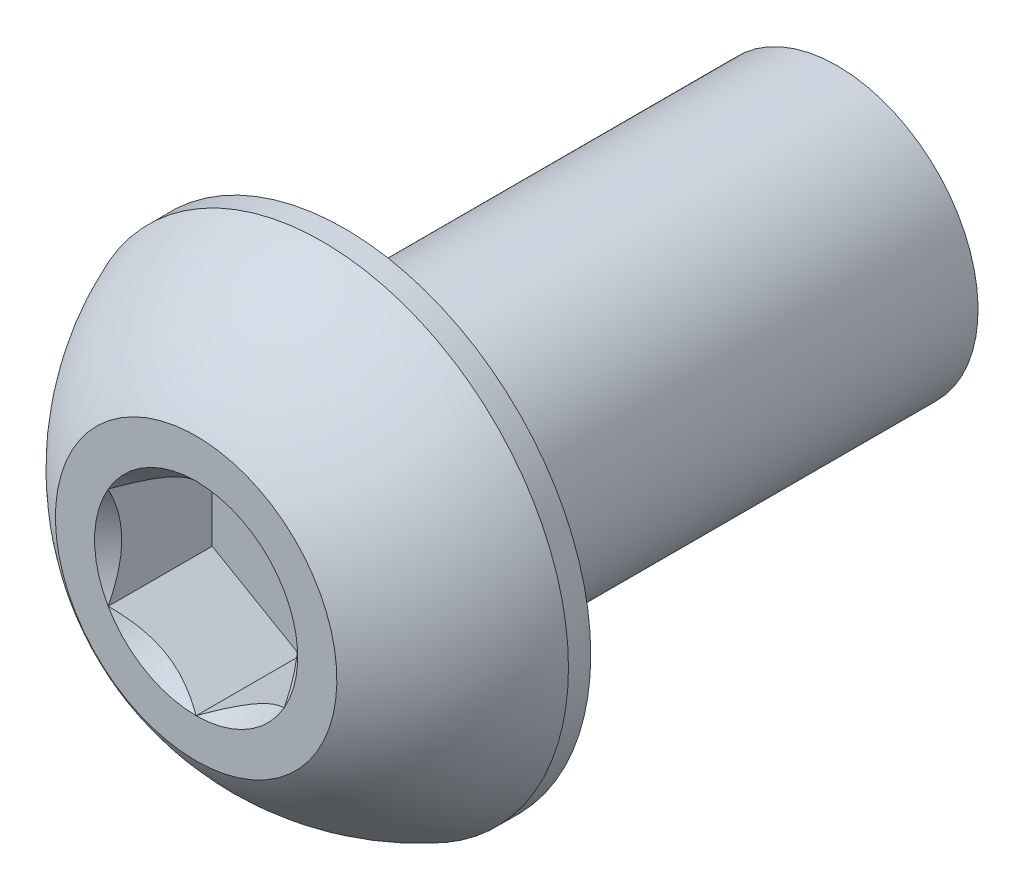
ISO-10303-21;
HEADER;
FILE_DESCRIPTION(('STEP AP214'),'2;1');
FILE_NAME('part.step','',(''),(''),'','','');
FILE_SCHEMA(('AUTOMOTIVE_DESIGN { 1 0 10303 214 1 1 1 1 }'));
ENDSEC;
DATA;
#1=APPLICATION_CONTEXT('core data for automotive mechanical design processes');
#2=APPLICATION_PROTOCOL_DEFINITION('international standard','automotive_design',2000,#1);
#3=PRODUCT_CONTEXT('',#1,'mechanical');
#4=PRODUCT('Part','Part','',(#3));
#5=PRODUCT_RELATED_PRODUCT_CATEGORY('part','',(#4));
#6=PRODUCT_DEFINITION_FORMATION('','',#4);
#7=PRODUCT_DEFINITION_CONTEXT('part definition',#1,'design');
#8=PRODUCT_DEFINITION('design','',#6,#7);
#9=PRODUCT_DEFINITION_SHAPE('','',#8);
#10=(LENGTH_UNIT() NAMED_UNIT(*) SI_UNIT(.MILLI.,.METRE.));
#11=(NAMED_UNIT(*) PLANE_ANGLE_UNIT() SI_UNIT($,.RADIAN.));
#12=(NAMED_UNIT(*) SI_UNIT($,.STERADIAN.) SOLID_ANGLE_UNIT());
#13=UNCERTAINTY_MEASURE_WITH_UNIT(LENGTH_MEASURE(1.E-05),#10,'distance_accuracy_value','');
#14=(GEOMETRIC_REPRESENTATION_CONTEXT(3) GLOBAL_UNCERTAINTY_ASSIGNED_CONTEXT((#13)) GLOBAL_UNIT_ASSIGNED_CONTEXT((#10,
#11,#12)) REPRESENTATION_CONTEXT('',''));
#15=CARTESIAN_POINT('',(0.,0.,0.));
#16=DIRECTION('',(0.,0.,1.));
#17=DIRECTION('',(1.,0.,0.));
#18=AXIS2_PLACEMENT_3D('',#15,#16,#17);
#19=CARTESIAN_POINT('',(0.,-3.17500000000001,-14.4653));
#20=DIRECTION('',(0.,0.,-1.));
#21=DIRECTION('',(0.,1.,0.));
#22=AXIS2_PLACEMENT_3D('',#19,#20,#21);
#23=PLANE('',#22);
#24=CARTESIAN_POINT('',(0.,0.,-14.4653));
#25=DIRECTION('',(0.,0.,-1.));
#26=DIRECTION('',(0.,1.,0.));
#27=AXIS2_PLACEMENT_3D('',#24,#25,#26);
#28=CIRCLE('',#27,3.17500000000001);
#29=CARTESIAN_POINT('',(0.,3.175,-14.4653));
#30=VERTEX_POINT('',#29);
#31=EDGE_CURVE('E49',#30,#30,#28,.T.);
#32=ORIENTED_EDGE('',*,*,#31,.T.);
#33=EDGE_LOOP('',(#32));
#34=FACE_BOUND('',#33,.T.);
#35=ADVANCED_FACE('F36',(#34),#23,.T.);
#36=CARTESIAN_POINT('',(0.,0.,-14.4653));
#37=DIRECTION('',(0.,0.,-1.));
#38=DIRECTION('',(0.,1.,0.));
#39=AXIS2_PLACEMENT_3D('',#36,#37,#38);
#40=CYLINDRICAL_SURFACE('',#39,3.17500000000001);
#41=CARTESIAN_POINT('',(0.,0.,-3.3528));
#42=DIRECTION('',(0.,0.,1.));
#43=DIRECTION('',(1.,0.,0.));
#44=AXIS2_PLACEMENT_3D('',#41,#42,#43);
#45=CIRCLE('',#44,3.17500000000001);
#46=CARTESIAN_POINT('',(3.17500000000001,0.,-3.3528));
#47=VERTEX_POINT('',#46);
#48=EDGE_CURVE('E172',#47,#47,#45,.F.);
#49=ORIENTED_EDGE('',*,*,#48,.T.);
#50=EDGE_LOOP('',(#49));
#51=FACE_BOUND('',#50,.T.);
#52=ORIENTED_EDGE('',*,*,#31,.F.);
#53=EDGE_LOOP('',(#52));
#54=FACE_BOUND('',#53,.T.);
#55=ADVANCED_FACE('F178',(#51,#54),#40,.T.);
#56=CARTESIAN_POINT('',(0.,0.,-5.060315));
#57=DIRECTION('',(0.,0.,1.));
#58=DIRECTION('',(0.,-1.,0.));
#59=AXIS2_PLACEMENT_3D('',#56,#57,#58);
#60=SPHERICAL_SURFACE('',#59,5.97389428256184);
#61=CARTESIAN_POINT('',(0.,0.,0.));
#62=DIRECTION('',(0.,0.,1.));
#63=DIRECTION('',(1.,0.,0.));
#64=AXIS2_PLACEMENT_3D('',#61,#62,#63);
#65=CIRCLE('',#64,3.175);
#66=CARTESIAN_POINT('',(0.,-3.175,0.));
#67=VERTEX_POINT('',#66);
#68=EDGE_CURVE('E169',#67,#67,#65,.T.);
#69=CARTESIAN_POINT('',(0.,0.,-2.84988));
#70=DIRECTION('',(0.,0.,1.));
#71=DIRECTION('',(1.,0.,0.));
#72=AXIS2_PLACEMENT_3D('',#69,#70,#71);
#73=CIRCLE('',#72,5.5499);
#74=CARTESIAN_POINT('',(0.,-5.5499,-2.84988));
#75=VERTEX_POINT('',#74);
#76=EDGE_CURVE('E163',#75,#75,#73,.T.);
#77=CARTESIAN_POINT('',(0.,-3.175,0.));
#78=CARTESIAN_POINT('',(0.,-3.20828343957184,-0.0208830076580488));
#79=CARTESIAN_POINT('',(0.,-3.24136078860705,-0.0420944789280492));
#80=CARTESIAN_POINT('',(0.,-3.3070905577514,-0.0851658910984713));
#81=CARTESIAN_POINT('',(0.,-3.33974297786056,-0.107025831998893));
#82=CARTESIAN_POINT('',(0.,-3.40461014130008,-0.151385725836676));
#83=CARTESIAN_POINT('',(0.,-3.43682488463043,-0.173885678774038));
#84=CARTESIAN_POINT('',(0.,-3.50080416139461,-0.219516822259478));
#85=CARTESIAN_POINT('',(0.,-3.53256869482844,-0.242648012807557));
#86=CARTESIAN_POINT('',(0.,-3.59563518208834,-0.289532629449102));
#87=CARTESIAN_POINT('',(0.,-3.62693713591442,-0.313286055542568));
#88=CARTESIAN_POINT('',(0.,-3.68906627753106,-0.361405894091329));
#89=CARTESIAN_POINT('',(0.,-3.71989346532163,-0.385772306546625));
#90=CARTESIAN_POINT('',(0.,-3.78106107243204,-0.435108631276876));
#91=CARTESIAN_POINT('',(0.,-3.81140149175189,-0.460078543551832));
#92=CARTESIAN_POINT('',(0.,-3.87158374923259,-0.510612146063937));
#93=CARTESIAN_POINT('',(0.,-3.90142558739343,-0.536175836301086));
#94=CARTESIAN_POINT('',(0.,-3.96059906392414,-0.587887041792083));
#95=CARTESIAN_POINT('',(0.,-3.989930702294,-0.614034557045931));
#96=CARTESIAN_POINT('',(0.,-4.04807235926832,-0.666903232293406));
#97=CARTESIAN_POINT('',(0.,-4.07688237787279,-0.693624392287033));
#98=CARTESIAN_POINT('',(0.,-4.13396957842491,-0.747629953401057));
#99=CARTESIAN_POINT('',(0.,-4.16224676037256,-0.774914354521453));
#100=CARTESIAN_POINT('',(0.,-4.21825727817542,-0.830035774981947));
#101=CARTESIAN_POINT('',(0.,-4.24599061403061,-0.857872794322044));
#102=CARTESIAN_POINT('',(0.,-4.30090264195357,-0.91408861315902));
#103=CARTESIAN_POINT('',(0.,-4.32808133402134,-0.942467412655899));
#104=CARTESIAN_POINT('',(0.,-4.38187349261952,-0.999755742806741));
#105=CARTESIAN_POINT('',(0.,-4.40848695914995,-1.0286652734607));
#106=CARTESIAN_POINT('',(0.,-4.46113830498838,-1.08700381029123));
#107=CARTESIAN_POINT('',(0.,-4.48717618429639,-1.11643281646778));
#108=CARTESIAN_POINT('',(0.,-4.53866621810402,-1.17579884645643));
#109=CARTESIAN_POINT('',(0.,-4.56411837260364,-1.20573587026853));
#110=CARTESIAN_POINT('',(0.,-4.61442704725457,-1.26610627984964));
#111=CARTESIAN_POINT('',(0.,-4.63928356740587,-1.29653966561866));
#112=CARTESIAN_POINT('',(0.,-4.68839129572448,-1.3578909501815));
#113=CARTESIAN_POINT('',(0.,-4.71264250389178,-1.38880884897531));
#114=CARTESIAN_POINT('',(0.,-4.76053016627881,-1.45111712201534));
#115=CARTESIAN_POINT('',(0.,-4.78416662049853,-1.48250749626155));
#116=CARTESIAN_POINT('',(0.,-4.8308155723751,-1.54574849868041));
#117=CARTESIAN_POINT('',(0.,-4.85382807003194,-1.57759912685306));
#118=CARTESIAN_POINT('',(0.,-4.89922014909859,-1.64174823640362));
#119=CARTESIAN_POINT('',(0.,-4.92159973050841,-1.67404671778154));
#120=CARTESIAN_POINT('',(0.,-4.96571726381658,-1.73907895865427));
#121=CARTESIAN_POINT('',(0.,-4.98745521571493,-1.77181271814908));
#122=CARTESIAN_POINT('',(0.,-5.03028102654719,-1.83770277069632));
#123=CARTESIAN_POINT('',(0.,-5.0513688854811,-1.87085906374874));
#124=CARTESIAN_POINT('',(0.,-5.09288630004063,-1.93758127434189));
#125=CARTESIAN_POINT('',(0.,-5.11331585566624,-1.97114719188261));
#126=CARTESIAN_POINT('',(0.,-5.15350870956168,-2.03867558290299));
#127=CARTESIAN_POINT('',(0.,-5.17327200783151,-2.07263805638265));
#128=CARTESIAN_POINT('',(0.,-5.21212465239608,-2.14094633632486));
#129=CARTESIAN_POINT('',(0.,-5.23121399869082,-2.17529214278741));
#130=CARTESIAN_POINT('',(0.,-5.26871130697935,-2.2443537165359));
#131=CARTESIAN_POINT('',(0.,-5.28711926897315,-2.27906948382184));
#132=CARTESIAN_POINT('',(0.,-5.32324664200827,-2.3488574628552));
#133=CARTESIAN_POINT('',(0.,-5.3409660530496,-2.38392967460262));
#134=CARTESIAN_POINT('',(0.,-5.37570942417474,-2.45441688802313));
#135=CARTESIAN_POINT('',(0.,-5.39273338425856,-2.48983188969622));
#136=CARTESIAN_POINT('',(0.,-5.42607922958184,-2.56099089271574));
#137=CARTESIAN_POINT('',(0.,-5.44240111482132,-2.59673489406217));
#138=CARTESIAN_POINT('',(0.,-5.47433643994316,-2.66853798649801));
#139=CARTESIAN_POINT('',(0.,-5.48994987982553,-2.70459707758742));
#140=CARTESIAN_POINT('',(0.,-5.52046229408188,-2.77701628549785));
#141=CARTESIAN_POINT('',(0.,-5.53536126845586,-2.81337640231887));
#142=CARTESIAN_POINT('',(0.,-5.5499,-2.84988));
#143=B_SPLINE_CURVE_WITH_KNOTS('',3,(#77,#78,#79,#80,#81,#82,#83,#84,#85,#86,#87,#88,#89,#90,
#91,#92,#93,#94,#95,#96,#97,#98,#99,#100,#101,#102,#103,#104,#105,#106,#107,#108,#109,#110,#111,
#112,#113,#114,#115,#116,#117,#118,#119,#120,#121,#122,#123,#124,#125,#126,#127,#128,#129,#130,
#131,#132,#133,#134,#135,#136,#137,#138,#139,#140,#141,#142),.UNSPECIFIED.,.F.,.F.,(4,2,2,2,2,2,
2,2,2,2,2,2,2,2,2,2,2,2,2,2,2,2,2,2,2,2,2,2,2,2,2,2,4),(0.,0.1178750807537,0.2357501615074,
0.353625242261099,0.471500323014799,0.589375403768499,0.707250484522198,0.825125565275897,
0.943000646029598,1.0608757267833,1.178750807537,1.2966258882907,1.41450096904439,
1.53237604979809,1.65025113055179,1.76812621130549,1.88600129205919,2.00387637281289,
2.12175145356659,2.23962653432029,2.35750161507399,2.47537669582769,2.59325177658139,
2.71112685733509,2.82900193808879,2.94687701884249,3.06475209959619,3.18262718034989,
3.30050226110359,3.41837734185729,3.53625242261099,3.65412750336469,3.77200258411839),.UNSPECIFIED.);
#144=EDGE_CURVE('BSEAM180',#67,#75,#143,.T.);
#145=ORIENTED_EDGE('',*,*,#68,.F.);
#146=ORIENTED_EDGE('',*,*,#76,.T.);
#147=ORIENTED_EDGE('',*,*,#144,.T.);
#148=ORIENTED_EDGE('',*,*,#144,.F.);
#149=EDGE_LOOP('',(#145,#147,#146,#148));
#150=FACE_BOUND('',#149,.T.);
#151=ADVANCED_FACE('F180',(#150),#60,.T.);
#152=CARTESIAN_POINT('',(0.,-3.175,0.));
#153=DIRECTION('',(0.,0.,-1.));
#154=DIRECTION('',(-1.,0.,0.));
#155=AXIS2_PLACEMENT_3D('',#152,#153,#154);
#156=PLANE('',#155);
#157=CARTESIAN_POINT('',(0.,0.,0.));
#158=DIRECTION('',(0.,0.,1.));
#159=DIRECTION('',(1.,0.,0.));
#160=AXIS2_PLACEMENT_3D('',#157,#158,#159);
#161=CIRCLE('',#160,2.29135888084633);
#162=CARTESIAN_POINT('',(-1.984375,1.14567944042316,0.));
#163=VERTEX_POINT('',#162);
#164=CARTESIAN_POINT('',(-1.984375,-1.14567944042316,0.));
#165=VERTEX_POINT('',#164);
#166=EDGE_CURVE('E62',#163,#165,#161,.T.);
#167=ORIENTED_EDGE('',*,*,#166,.F.);
#168=CARTESIAN_POINT('',(0.,2.29135888084633,0.));
#169=VERTEX_POINT('',#168);
#170=EDGE_CURVE('E134',#169,#163,#161,.T.);
#171=ORIENTED_EDGE('',*,*,#170,.F.);
#172=CARTESIAN_POINT('',(1.984375,1.14567944042316,0.));
#173=VERTEX_POINT('',#172);
#174=EDGE_CURVE('E131',#173,#169,#161,.T.);
#175=ORIENTED_EDGE('',*,*,#174,.F.);
#176=CARTESIAN_POINT('',(1.984375,-1.14567944042316,0.));
#177=VERTEX_POINT('',#176);
#178=EDGE_CURVE('E102',#177,#173,#161,.T.);
#179=ORIENTED_EDGE('',*,*,#178,.F.);
#180=CARTESIAN_POINT('',(0.,-2.29135888084633,0.));
#181=VERTEX_POINT('',#180);
#182=EDGE_CURVE('E94',#181,#177,#161,.T.);
#183=ORIENTED_EDGE('',*,*,#182,.F.);
#184=EDGE_CURVE('E55',#165,#181,#161,.T.);
#185=ORIENTED_EDGE('',*,*,#184,.F.);
#186=EDGE_LOOP('',(#167,#171,#175,#179,#183,#185));
#187=FACE_BOUND('',#186,.T.);
#188=ORIENTED_EDGE('',*,*,#68,.T.);
#189=EDGE_LOOP('',(#188));
#190=FACE_BOUND('',#189,.T.);
#191=ADVANCED_FACE('F128',(#187,#190),#156,.F.);
#192=CARTESIAN_POINT('',(0.,-5.5499,-3.3528));
#193=DIRECTION('',(0.,0.,1.));
#194=DIRECTION('',(1.,0.,0.));
#195=AXIS2_PLACEMENT_3D('',#192,#193,#194);
#196=PLANE('',#195);
#197=ORIENTED_EDGE('',*,*,#48,.F.);
#198=EDGE_LOOP('',(#197));
#199=FACE_BOUND('',#198,.T.);
#200=CARTESIAN_POINT('',(0.,0.,-3.3528));
#201=DIRECTION('',(0.,0.,1.));
#202=DIRECTION('',(1.,0.,0.));
#203=AXIS2_PLACEMENT_3D('',#200,#201,#202);
#204=CIRCLE('',#203,5.5499);
#205=CARTESIAN_POINT('',(5.5499,0.,-3.3528));
#206=VERTEX_POINT('',#205);
#207=EDGE_CURVE('E166',#206,#206,#204,.T.);
#208=ORIENTED_EDGE('',*,*,#207,.F.);
#209=EDGE_LOOP('',(#208));
#210=FACE_BOUND('',#209,.T.);
#211=ADVANCED_FACE('F191',(#199,#210),#196,.F.);
#212=CARTESIAN_POINT('',(0.,0.,0.));
#213=DIRECTION('',(0.,0.,1.));
#214=DIRECTION('',(1.,0.,0.));
#215=AXIS2_PLACEMENT_3D('',#212,#213,#214);
#216=CYLINDRICAL_SURFACE('',#215,5.5499);
#217=ORIENTED_EDGE('',*,*,#76,.F.);
#218=EDGE_LOOP('',(#217));
#219=FACE_BOUND('',#218,.T.);
#220=ORIENTED_EDGE('',*,*,#207,.T.);
#221=EDGE_LOOP('',(#220));
#222=FACE_BOUND('',#221,.T.);
#223=ADVANCED_FACE('F194',(#219,#222),#216,.T.);
#224=CARTESIAN_POINT('',(0.,0.,0.));
#225=DIRECTION('',(0.,0.,1.));
#226=DIRECTION('',(1.,0.,0.));
#227=AXIS2_PLACEMENT_3D('',#224,#225,#226);
#228=CONICAL_SURFACE('',#227,2.29135888084633,0.78539816339745);
#229=ORIENTED_EDGE('',*,*,#178,.T.);
#230=CARTESIAN_POINT('',(1.984375,-2.28495242157822,0.734984078816568));
#231=CARTESIAN_POINT('',(1.984375,-2.22931635455402,0.692986685550761));
#232=CARTESIAN_POINT('',(1.984375,-2.17336876548389,0.651396054076336));
#233=CARTESIAN_POINT('',(1.984375,-2.06072770258171,0.569208461471479));
#234=CARTESIAN_POINT('',(1.984375,-2.00403404503435,0.528611752405042));
#235=CARTESIAN_POINT('',(1.984375,-1.88936329173488,0.448303503174669));
#236=CARTESIAN_POINT('',(1.984375,-1.83137965519348,0.408601258813307));
#237=CARTESIAN_POINT('',(1.984375,-1.7144280213784,0.330685173401292));
#238=CARTESIAN_POINT('',(1.984375,-1.65546009407228,0.292471227194368));
#239=CARTESIAN_POINT('',(1.984375,-1.47005472306035,0.176252834013636));
#240=CARTESIAN_POINT('',(1.984375,-1.34163909427883,0.101347886872381));
#241=CARTESIAN_POINT('',(1.984375,-1.0784038470548,-0.0356697845602626));
#242=CARTESIAN_POINT('',(1.984375,-0.943607781407425,-0.0978256335176257));
#243=CARTESIAN_POINT('',(1.984375,-0.741275100444882,-0.173867421311381));
#244=CARTESIAN_POINT('',(1.984375,-0.676735408881095,-0.195691938673995));
#245=CARTESIAN_POINT('',(1.984375,-0.546098118112762,-0.234159536462205));
#246=CARTESIAN_POINT('',(1.984375,-0.480000411919956,-0.250802259934452));
#247=CARTESIAN_POINT('',(1.984375,-0.347746170028532,-0.277764619130277));
#248=CARTESIAN_POINT('',(1.984375,-0.281612071479123,-0.288192590264108));
#249=CARTESIAN_POINT('',(1.984375,-0.14863662005235,-0.302521852623404));
#250=CARTESIAN_POINT('',(1.984375,-0.0817953907393235,-0.306424265772614));
#251=CARTESIAN_POINT('',(1.984375,0.0495156750890646,-0.307412948667328));
#252=CARTESIAN_POINT('',(1.984375,0.113983775102992,-0.304740821124985));
#253=CARTESIAN_POINT('',(1.984375,0.242367515846177,-0.293260789502485));
#254=CARTESIAN_POINT('',(1.984375,0.30628310229592,-0.284452289360786));
#255=CARTESIAN_POINT('',(1.984375,0.434181040262184,-0.261030978667103));
#256=CARTESIAN_POINT('',(1.984375,0.498145026858309,-0.246319393767914));
#257=CARTESIAN_POINT('',(1.984375,0.624675616953007,-0.211873818587874));
#258=CARTESIAN_POINT('',(1.984375,0.687242336899689,-0.192140248550805));
#259=CARTESIAN_POINT('',(1.984375,0.884225483826087,-0.12258776276924));
#260=CARTESIAN_POINT('',(1.984375,1.01583674256468,-0.0648475887435035));
#261=CARTESIAN_POINT('',(1.984375,1.27288659242652,0.0635303365887973));
#262=CARTESIAN_POINT('',(1.984375,1.3983008827048,0.134214424919412));
#263=CARTESIAN_POINT('',(1.984375,1.57956687990221,0.244516663813198));
#264=CARTESIAN_POINT('',(1.984375,1.63738271299424,0.280969829475363));
#265=CARTESIAN_POINT('',(1.984375,1.75202215386201,0.355415963291704));
#266=CARTESIAN_POINT('',(1.984375,1.80884568601361,0.393409048078053));
#267=CARTESIAN_POINT('',(1.984375,1.92116923084255,0.470338808893089));
#268=CARTESIAN_POINT('',(1.984375,1.97667624512253,0.50926531303879));
#269=CARTESIAN_POINT('',(1.984375,2.08693170717166,0.588147746121385));
#270=CARTESIAN_POINT('',(1.984375,2.14168035934792,0.628103389024029));
#271=CARTESIAN_POINT('',(1.984375,2.19611149046622,0.668480611285425));
#272=B_SPLINE_CURVE_WITH_KNOTS('',3,(#230,#231,#232,#233,#234,#235,#236,#237,#238,#239,#240,
#241,#242,#243,#244,#245,#246,#247,#248,#249,#250,#251,#252,#253,#254,#255,#256,#257,#258,#259,
#260,#261,#262,#263,#264,#265,#266,#267,#268,#269,#270,#271),.UNSPECIFIED.,.F.,.F.,(4,2,2,2,2,2,
2,2,2,2,2,2,2,2,2,2,2,2,2,2,4),(0.,0.209126070008322,0.418304637356569,0.629103979977992,
0.839888401371185,1.28549951116127,1.72957750768351,1.93379389749971,2.13802435186698,
2.33858179514334,2.53910475350639,2.73236963400794,2.92565329006887,3.12231577097487,
3.31896180041345,3.74886295245172,4.18033428125362,4.3853601718029,4.59040161996382,
4.79377749165107,4.99709743524131),.UNSPECIFIED.);
#273=EDGE_CURVE('E11',#177,#173,#272,.T.);
#274=ORIENTED_EDGE('',*,*,#273,.F.);
#275=EDGE_LOOP('',(#229,#274));
#276=FACE_BOUND('',#275,.T.);
#277=ADVANCED_FACE('F106',(#276),#228,.F.);
#278=ORIENTED_EDGE('',*,*,#174,.T.);
#279=CARTESIAN_POINT('',(1.984575,1.14556397036933,0.000115478781843379));
#280=CARTESIAN_POINT('',(1.9163590048332,1.18494849354192,-0.0392371477360852));
#281=CARTESIAN_POINT('',(1.84700231489303,1.22499159714897,-0.0762786895538154));
#282=CARTESIAN_POINT('',(1.70557619954781,1.30664400291398,-0.144101141576677));
#283=CARTESIAN_POINT('',(1.63349332126322,1.34826107209555,-0.174844310908246));
#284=CARTESIAN_POINT('',(1.488141602734,1.43217992591557,-0.227508111188786));
#285=CARTESIAN_POINT('',(1.41490978751306,1.47446033414663,-0.249561124120036));
#286=CARTESIAN_POINT('',(1.26683381740529,1.55995203534886,-0.283538507056124));
#287=CARTESIAN_POINT('',(1.19199418724658,1.60316071596705,-0.295488243908272));
#288=CARTESIAN_POINT('',(1.06301458545618,1.6776271237807,-0.306269900918094));
#289=CARTESIAN_POINT('',(1.00904128422756,1.7087886237741,-0.30786610094093));
#290=CARTESIAN_POINT('',(0.901182881480199,1.77106070163465,-0.305178161134708));
#291=CARTESIAN_POINT('',(0.847297817514476,1.80217125782056,-0.300891959659541));
#292=CARTESIAN_POINT('',(0.740036461751395,1.86409863044402,-0.286683126986481));
#293=CARTESIAN_POINT('',(0.686660807239859,1.89491507894443,-0.276754189547727));
#294=CARTESIAN_POINT('',(0.580832482591103,1.95601509066828,-0.251804915725461));
#295=CARTESIAN_POINT('',(0.528379742028898,1.9862986945516,-0.236784969610512));
#296=CARTESIAN_POINT('',(0.394017661036351,2.06387267818152,-0.19219214836433));
#297=CARTESIAN_POINT('',(0.312941642841675,2.11068193911104,-0.159257004061668));
#298=CARTESIAN_POINT('',(0.19372669327016,2.17951072233758,-0.103657558797803));
#299=CARTESIAN_POINT('',(0.154440075613998,2.20219286161692,-0.0841224079481377));
#300=CARTESIAN_POINT('',(0.0765946381319466,2.24713694590237,-0.0432712618805983));
#301=CARTESIAN_POINT('',(0.0380353888983007,2.26939913882716,-0.0219563604316494));
#302=CARTESIAN_POINT('',(-0.000200000000000694,2.29147435090017,0.000115478781842942));
#303=B_SPLINE_CURVE_WITH_KNOTS('',3,(#279,#280,#281,#282,#283,#284,#285,#286,#287,#288,#289,
#290,#291,#292,#293,#294,#295,#296,#297,#298,#299,#300,#301,#302),.UNSPECIFIED.,.F.,.F.,(4,2,2,
2,2,2,2,2,2,2,2,4),(0.,0.264339630306627,0.530219665093694,0.791876416371461,1.05287424418109,
1.239639843932,1.42647091743852,1.61351120244035,1.8005371524754,2.09764209964316,
2.24579179873714,2.39385111134157),.UNSPECIFIED.);
#304=EDGE_CURVE('E133',#173,#169,#303,.T.);
#305=ORIENTED_EDGE('',*,*,#304,.F.);
#306=EDGE_LOOP('',(#278,#305));
#307=FACE_BOUND('',#306,.T.);
#308=ADVANCED_FACE('F279',(#307),#228,.F.);
#309=ORIENTED_EDGE('',*,*,#170,.T.);
#310=CARTESIAN_POINT('',(0.000199999999999584,2.29147435090017,0.000115478781843248));
#311=CARTESIAN_POINT('',(-0.0680159951668027,2.25208982772757,-0.0392371477360854));
#312=CARTESIAN_POINT('',(-0.137372685106966,2.21204672412052,-0.0762786895538155));
#313=CARTESIAN_POINT('',(-0.278798800452188,2.13039431835551,-0.144101141576677));
#314=CARTESIAN_POINT('',(-0.350881678736783,2.08877724917394,-0.174844310908246));
#315=CARTESIAN_POINT('',(-0.496233397266004,2.00485839535392,-0.227508111188786));
#316=CARTESIAN_POINT('',(-0.569465212486939,1.96257798712287,-0.249561124120036));
#317=CARTESIAN_POINT('',(-0.717541182594707,1.87708628592063,-0.283538507056124));
#318=CARTESIAN_POINT('',(-0.792380812753425,1.83387760530244,-0.295488243908272));
#319=CARTESIAN_POINT('',(-0.921360414543816,1.75941119748879,-0.306269900918094));
#320=CARTESIAN_POINT('',(-0.975333715772443,1.72824969749539,-0.307866100940931));
#321=CARTESIAN_POINT('',(-1.0831921185198,1.66597761963484,-0.305178161134708));
#322=CARTESIAN_POINT('',(-1.13707718248552,1.63486706344893,-0.300891959659541));
#323=CARTESIAN_POINT('',(-1.2443385382486,1.57293969082547,-0.286683126986481));
#324=CARTESIAN_POINT('',(-1.29771419276014,1.54212324232506,-0.276754189547727));
#325=CARTESIAN_POINT('',(-1.4035425174089,1.48102323060122,-0.251804915725462));
#326=CARTESIAN_POINT('',(-1.4559952579711,1.45073962671789,-0.236784969610512));
#327=CARTESIAN_POINT('',(-1.59035733896365,1.37316564308797,-0.19219214836433));
#328=CARTESIAN_POINT('',(-1.67143335715832,1.32635638215845,-0.159257004061668));
#329=CARTESIAN_POINT('',(-1.79064830672984,1.25752759893191,-0.103657558797804));
#330=CARTESIAN_POINT('',(-1.829934924386,1.23484545965257,-0.0841224079481378));
#331=CARTESIAN_POINT('',(-1.90778036186805,1.18990137536712,-0.0432712618805986));
#332=CARTESIAN_POINT('',(-1.9463396111017,1.16763918244233,-0.0219563604316498));
#333=CARTESIAN_POINT('',(-1.984575,1.14556397036933,0.000115478781842511));
#334=B_SPLINE_CURVE_WITH_KNOTS('',3,(#310,#311,#312,#313,#314,#315,#316,#317,#318,#319,#320,
#321,#322,#323,#324,#325,#326,#327,#328,#329,#330,#331,#332,#333),.UNSPECIFIED.,.F.,.F.,(4,2,2,
2,2,2,2,2,2,2,2,4),(0.,0.264339630306627,0.530219665093694,0.791876416371461,1.05287424418109,
1.239639843932,1.42647091743852,1.61351120244035,1.8005371524754,2.09764209964316,
2.24579179873714,2.39385111134157),.UNSPECIFIED.);
#335=EDGE_CURVE('E138',#169,#163,#334,.T.);
#336=ORIENTED_EDGE('',*,*,#335,.F.);
#337=EDGE_LOOP('',(#309,#336));
#338=FACE_BOUND('',#337,.T.);
#339=ADVANCED_FACE('F141',(#338),#228,.F.);
#340=ORIENTED_EDGE('',*,*,#166,.T.);
#341=CARTESIAN_POINT('',(-1.984375,-2.28495242157822,0.734984078816568));
#342=CARTESIAN_POINT('',(-1.984375,-2.22931635455402,0.692986685550762));
#343=CARTESIAN_POINT('',(-1.984375,-2.17336876548389,0.651396054076336));
#344=CARTESIAN_POINT('',(-1.984375,-2.06072770258171,0.569208461471479));
#345=CARTESIAN_POINT('',(-1.984375,-2.00403404503435,0.528611752405043));
#346=CARTESIAN_POINT('',(-1.984375,-1.88936329173489,0.448303503174669));
#347=CARTESIAN_POINT('',(-1.984375,-1.83137965519348,0.408601258813307));
#348=CARTESIAN_POINT('',(-1.984375,-1.7144280213784,0.330685173401292));
#349=CARTESIAN_POINT('',(-1.984375,-1.65546009407228,0.292471227194368));
#350=CARTESIAN_POINT('',(-1.984375,-1.47005472306035,0.176252834013636));
#351=CARTESIAN_POINT('',(-1.984375,-1.34163909427883,0.101347886872381));
#352=CARTESIAN_POINT('',(-1.984375,-1.0784038470548,-0.0356697845602625));
#353=CARTESIAN_POINT('',(-1.984375,-0.943607781407425,-0.0978256335176254));
#354=CARTESIAN_POINT('',(-1.984375,-0.741275100444882,-0.173867421311381));
#355=CARTESIAN_POINT('',(-1.984375,-0.676735408881095,-0.195691938673995));
#356=CARTESIAN_POINT('',(-1.984375,-0.546098118112762,-0.234159536462205));
#357=CARTESIAN_POINT('',(-1.984375,-0.480000411919956,-0.250802259934452));
#358=CARTESIAN_POINT('',(-1.984375,-0.347746170028532,-0.277764619130277));
#359=CARTESIAN_POINT('',(-1.984375,-0.281612071479123,-0.288192590264108));
#360=CARTESIAN_POINT('',(-1.984375,-0.14863662005235,-0.302521852623404));
#361=CARTESIAN_POINT('',(-1.984375,-0.0817953907393238,-0.306424265772614));
#362=CARTESIAN_POINT('',(-1.984375,0.0495156750890643,-0.307412948667328));
#363=CARTESIAN_POINT('',(-1.984375,0.113983775102991,-0.304740821124985));
#364=CARTESIAN_POINT('',(-1.984375,0.242367515846177,-0.293260789502485));
#365=CARTESIAN_POINT('',(-1.984375,0.306283102295919,-0.284452289360786));
#366=CARTESIAN_POINT('',(-1.984375,0.434181040262184,-0.261030978667103));
#367=CARTESIAN_POINT('',(-1.984375,0.498145026858309,-0.246319393767914));
#368=CARTESIAN_POINT('',(-1.984375,0.624675616953007,-0.211873818587874));
#369=CARTESIAN_POINT('',(-1.984375,0.687242336899689,-0.192140248550805));
#370=CARTESIAN_POINT('',(-1.984375,0.884225483826087,-0.12258776276924));
#371=CARTESIAN_POINT('',(-1.984375,1.01583674256468,-0.0648475887435032));
#372=CARTESIAN_POINT('',(-1.984375,1.27288659242652,0.0635303365887978));
#373=CARTESIAN_POINT('',(-1.984375,1.3983008827048,0.134214424919412));
#374=CARTESIAN_POINT('',(-1.984375,1.57956687990221,0.244516663813198));
#375=CARTESIAN_POINT('',(-1.984375,1.63738271299424,0.280969829475363));
#376=CARTESIAN_POINT('',(-1.984375,1.75202215386202,0.355415963291704));
#377=CARTESIAN_POINT('',(-1.984375,1.80884568601362,0.393409048078053));
#378=CARTESIAN_POINT('',(-1.984375,1.92116923084255,0.47033880889309));
#379=CARTESIAN_POINT('',(-1.984375,1.97667624512253,0.509265313038791));
#380=CARTESIAN_POINT('',(-1.984375,2.08693170717166,0.588147746121386));
#381=CARTESIAN_POINT('',(-1.984375,2.14168035934793,0.628103389024029));
#382=CARTESIAN_POINT('',(-1.984375,2.19611149046622,0.668480611285426));
#383=B_SPLINE_CURVE_WITH_KNOTS('',3,(#341,#342,#343,#344,#345,#346,#347,#348,#349,#350,#351,
#352,#353,#354,#355,#356,#357,#358,#359,#360,#361,#362,#363,#364,#365,#366,#367,#368,#369,#370,
#371,#372,#373,#374,#375,#376,#377,#378,#379,#380,#381,#382),.UNSPECIFIED.,.F.,.F.,(4,2,2,2,2,2,
2,2,2,2,2,2,2,2,2,2,2,2,2,2,4),(0.,0.209126070008322,0.41830463735657,0.629103979977993,
0.839888401371186,1.28549951116127,1.72957750768351,1.93379389749972,2.13802435186698,
2.33858179514334,2.53910475350639,2.73236963400794,2.92565329006887,3.12231577097487,
3.31896180041345,3.74886295245172,4.18033428125362,4.3853601718029,4.59040161996383,
4.79377749165108,4.99709743524131),.UNSPECIFIED.);
#384=EDGE_CURVE('E145',#163,#165,#383,.F.);
#385=ORIENTED_EDGE('',*,*,#384,.F.);
#386=EDGE_LOOP('',(#340,#385));
#387=FACE_BOUND('',#386,.T.);
#388=ADVANCED_FACE('F273',(#387),#228,.F.);
#389=ORIENTED_EDGE('',*,*,#184,.T.);
#390=CARTESIAN_POINT('',(-1.984575,-1.14556397036933,0.000115478781842946));
#391=CARTESIAN_POINT('',(-1.9163590048332,-1.18494849354192,-0.0392371477360854));
#392=CARTESIAN_POINT('',(-1.84700231489303,-1.22499159714897,-0.0762786895538155));
#393=CARTESIAN_POINT('',(-1.70557619954781,-1.30664400291398,-0.144101141576677));
#394=CARTESIAN_POINT('',(-1.63349332126322,-1.34826107209555,-0.174844310908246));
#395=CARTESIAN_POINT('',(-1.488141602734,-1.43217992591557,-0.227508111188786));
#396=CARTESIAN_POINT('',(-1.41490978751306,-1.47446033414662,-0.249561124120036));
#397=CARTESIAN_POINT('',(-1.26683381740529,-1.55995203534886,-0.283538507056125));
#398=CARTESIAN_POINT('',(-1.19199418724658,-1.60316071596705,-0.295488243908272));
#399=CARTESIAN_POINT('',(-1.06301458545618,-1.6776271237807,-0.306269900918095));
#400=CARTESIAN_POINT('',(-1.00904128422756,-1.7087886237741,-0.307866100940931));
#401=CARTESIAN_POINT('',(-0.9011828814802,-1.77106070163465,-0.305178161134708));
#402=CARTESIAN_POINT('',(-0.847297817514477,-1.80217125782056,-0.300891959659541));
#403=CARTESIAN_POINT('',(-0.740036461751396,-1.86409863044402,-0.286683126986481));
#404=CARTESIAN_POINT('',(-0.68666080723986,-1.89491507894443,-0.276754189547728));
#405=CARTESIAN_POINT('',(-0.580832482591103,-1.95601509066827,-0.251804915725462));
#406=CARTESIAN_POINT('',(-0.528379742028898,-1.9862986945516,-0.236784969610513));
#407=CARTESIAN_POINT('',(-0.394017661036351,-2.06387267818152,-0.192192148364331));
#408=CARTESIAN_POINT('',(-0.312941642841675,-2.11068193911104,-0.159257004061668));
#409=CARTESIAN_POINT('',(-0.19372669327016,-2.17951072233758,-0.103657558797804));
#410=CARTESIAN_POINT('',(-0.154440075613998,-2.20219286161692,-0.0841224079481377));
#411=CARTESIAN_POINT('',(-0.0765946381319458,-2.24713694590237,-0.0432712618805983));
#412=CARTESIAN_POINT('',(-0.0380353888982999,-2.26939913882716,-0.0219563604316494));
#413=CARTESIAN_POINT('',(0.000200000000001552,-2.29147435090017,0.000115478781842944));
#414=B_SPLINE_CURVE_WITH_KNOTS('',3,(#390,#391,#392,#393,#394,#395,#396,#397,#398,#399,#400,
#401,#402,#403,#404,#405,#406,#407,#408,#409,#410,#411,#412,#413),.UNSPECIFIED.,.F.,.F.,(4,2,2,
2,2,2,2,2,2,2,2,4),(0.,0.264339630306627,0.530219665093694,0.79187641637146,1.05287424418109,
1.239639843932,1.42647091743852,1.61351120244035,1.8005371524754,2.09764209964316,
2.24579179873714,2.39385111134157),.UNSPECIFIED.);
#415=EDGE_CURVE('E118',#165,#181,#414,.T.);
#416=ORIENTED_EDGE('',*,*,#415,.F.);
#417=EDGE_LOOP('',(#389,#416));
#418=FACE_BOUND('',#417,.T.);
#419=ADVANCED_FACE('F221',(#418),#228,.F.);
#420=ORIENTED_EDGE('',*,*,#182,.T.);
#421=CARTESIAN_POINT('',(-0.000199999999998723,-2.29147435090017,0.000115478781843248));
#422=CARTESIAN_POINT('',(0.0680159951668037,-2.25208982772757,-0.0392371477360849));
#423=CARTESIAN_POINT('',(0.137372685106967,-2.21204672412052,-0.076278689553815));
#424=CARTESIAN_POINT('',(0.278798800452189,-2.13039431835551,-0.144101141576677));
#425=CARTESIAN_POINT('',(0.350881678736784,-2.08877724917394,-0.174844310908246));
#426=CARTESIAN_POINT('',(0.496233397266005,-2.00485839535392,-0.227508111188786));
#427=CARTESIAN_POINT('',(0.56946521248694,-1.96257798712287,-0.249561124120036));
#428=CARTESIAN_POINT('',(0.717541182594708,-1.87708628592063,-0.283538507056124));
#429=CARTESIAN_POINT('',(0.792380812753426,-1.83387760530244,-0.295488243908271));
#430=CARTESIAN_POINT('',(0.921360414543817,-1.75941119748879,-0.306269900918094));
#431=CARTESIAN_POINT('',(0.975333715772444,-1.72824969749539,-0.30786610094093));
#432=CARTESIAN_POINT('',(1.0831921185198,-1.66597761963484,-0.305178161134707));
#433=CARTESIAN_POINT('',(1.13707718248553,-1.63486706344893,-0.30089195965954));
#434=CARTESIAN_POINT('',(1.24433853824861,-1.57293969082547,-0.286683126986481));
#435=CARTESIAN_POINT('',(1.29771419276014,-1.54212324232506,-0.276754189547727));
#436=CARTESIAN_POINT('',(1.4035425174089,-1.48102323060122,-0.251804915725461));
#437=CARTESIAN_POINT('',(1.4559952579711,-1.45073962671789,-0.236784969610511));
#438=CARTESIAN_POINT('',(1.59035733896365,-1.37316564308797,-0.192192148364329));
#439=CARTESIAN_POINT('',(1.67143335715833,-1.32635638215845,-0.159257004061667));
#440=CARTESIAN_POINT('',(1.79064830672984,-1.25752759893191,-0.103657558797803));
#441=CARTESIAN_POINT('',(1.829934924386,-1.23484545965257,-0.0841224079481373));
#442=CARTESIAN_POINT('',(1.90778036186805,-1.18990137536712,-0.0432712618805982));
#443=CARTESIAN_POINT('',(1.9463396111017,-1.16763918244233,-0.0219563604316493));
#444=CARTESIAN_POINT('',(1.984575,-1.14556397036933,0.000115478781843057));
#445=B_SPLINE_CURVE_WITH_KNOTS('',3,(#421,#422,#423,#424,#425,#426,#427,#428,#429,#430,#431,
#432,#433,#434,#435,#436,#437,#438,#439,#440,#441,#442,#443,#444),.UNSPECIFIED.,.F.,.F.,(4,2,2,
2,2,2,2,2,2,2,2,4),(0.,0.264339630306627,0.530219665093694,0.791876416371461,1.05287424418109,
1.239639843932,1.42647091743852,1.61351120244035,1.8005371524754,2.09764209964316,
2.24579179873714,2.39385111134157),.UNSPECIFIED.);
#446=EDGE_CURVE('E98',#181,#177,#445,.T.);
#447=ORIENTED_EDGE('',*,*,#446,.F.);
#448=EDGE_LOOP('',(#420,#447));
#449=FACE_BOUND('',#448,.T.);
#450=ADVANCED_FACE('F96',(#449),#228,.F.);
#451=CARTESIAN_POINT('',(1.984375,-1.14567944042316,-2.34696));
#452=DIRECTION('',(0.,0.,1.));
#453=DIRECTION('',(1.,0.,0.));
#454=AXIS2_PLACEMENT_3D('',#451,#452,#453);
#455=PLANE('',#454);
#456=DIRECTION('',(0.866025403784438,0.5,0.));
#457=VECTOR('',#456,1.);
#458=CARTESIAN_POINT('',(0.,-2.29135888084633,-2.34696));
#459=LINE('',#458,#457);
#460=CARTESIAN_POINT('',(0.,-2.29135888084633,-2.34696));
#461=VERTEX_POINT('',#460);
#462=CARTESIAN_POINT('',(1.984375,-1.14567944042316,-2.34696));
#463=VERTEX_POINT('',#462);
#464=EDGE_CURVE('E117',#461,#463,#459,.T.);
#465=ORIENTED_EDGE('',*,*,#464,.T.);
#466=DIRECTION('',(0.,1.,0.));
#467=VECTOR('',#466,1.);
#468=CARTESIAN_POINT('',(1.984375,-1.14567944042316,-2.34696));
#469=LINE('',#468,#467);
#470=CARTESIAN_POINT('',(1.984375,1.14567944042316,-2.34696));
#471=VERTEX_POINT('',#470);
#472=EDGE_CURVE('E122',#463,#471,#469,.T.);
#473=ORIENTED_EDGE('',*,*,#472,.T.);
#474=DIRECTION('',(-0.866025403784439,0.5,0.));
#475=VECTOR('',#474,1.);
#476=CARTESIAN_POINT('',(1.984375,1.14567944042316,-2.34696));
#477=LINE('',#476,#475);
#478=CARTESIAN_POINT('',(0.,2.29135888084633,-2.34696));
#479=VERTEX_POINT('',#478);
#480=EDGE_CURVE('E263',#471,#479,#477,.T.);
#481=ORIENTED_EDGE('',*,*,#480,.T.);
#482=DIRECTION('',(-0.866025403784438,-0.5,0.));
#483=VECTOR('',#482,1.);
#484=CARTESIAN_POINT('',(0.,2.29135888084633,-2.34696));
#485=LINE('',#484,#483);
#486=CARTESIAN_POINT('',(-1.984375,1.14567944042316,-2.34696));
#487=VERTEX_POINT('',#486);
#488=EDGE_CURVE('E154',#479,#487,#485,.T.);
#489=ORIENTED_EDGE('',*,*,#488,.T.);
#490=DIRECTION('',(0.,-1.,0.));
#491=VECTOR('',#490,1.);
#492=CARTESIAN_POINT('',(-1.984375,1.14567944042316,-2.34696));
#493=LINE('',#492,#491);
#494=CARTESIAN_POINT('',(-1.984375,-1.14567944042316,-2.34696));
#495=VERTEX_POINT('',#494);
#496=EDGE_CURVE('E267',#487,#495,#493,.T.);
#497=ORIENTED_EDGE('',*,*,#496,.T.);
#498=DIRECTION('',(0.866025403784439,-0.5,0.));
#499=VECTOR('',#498,1.);
#500=CARTESIAN_POINT('',(-1.984375,-1.14567944042316,-2.34696));
#501=LINE('',#500,#499);
#502=EDGE_CURVE('E125',#495,#461,#501,.T.);
#503=ORIENTED_EDGE('',*,*,#502,.T.);
#504=EDGE_LOOP('',(#465,#473,#481,#489,#497,#503));
#505=FACE_BOUND('',#504,.T.);
#506=ADVANCED_FACE('F220',(#505),#455,.T.);
#507=CARTESIAN_POINT('',(1.984375,-1.14567944042316,-2.34696));
#508=DIRECTION('',(1.,0.,0.));
#509=DIRECTION('',(0.,0.,-1.));
#510=AXIS2_PLACEMENT_3D('',#507,#508,#509);
#511=PLANE('',#510);
#512=DIRECTION('',(0.,0.,1.));
#513=VECTOR('',#512,1.);
#514=CARTESIAN_POINT('',(1.984375,-1.14567944042316,-2.34696));
#515=LINE('',#514,#513);
#516=EDGE_CURVE('E114',#463,#177,#515,.T.);
#517=ORIENTED_EDGE('',*,*,#516,.T.);
#518=ORIENTED_EDGE('',*,*,#273,.T.);
#519=DIRECTION('',(0.,0.,1.));
#520=VECTOR('',#519,1.);
#521=CARTESIAN_POINT('',(1.984375,1.14567944042316,-2.34696));
#522=LINE('',#521,#520);
#523=EDGE_CURVE('E124',#471,#173,#522,.T.);
#524=ORIENTED_EDGE('',*,*,#523,.F.);
#525=ORIENTED_EDGE('',*,*,#472,.F.);
#526=EDGE_LOOP('',(#517,#518,#524,#525));
#527=FACE_BOUND('',#526,.T.);
#528=ADVANCED_FACE('F120',(#527),#511,.F.);
#529=CARTESIAN_POINT('',(1.984375,1.14567944042316,-2.34696));
#530=DIRECTION('',(0.5,0.866025403784439,0.));
#531=DIRECTION('',(-0.866025403784439,0.5,0.));
#532=AXIS2_PLACEMENT_3D('',#529,#530,#531);
#533=PLANE('',#532);
#534=ORIENTED_EDGE('',*,*,#523,.T.);
#535=ORIENTED_EDGE('',*,*,#304,.T.);
#536=DIRECTION('',(0.,0.,1.));
#537=VECTOR('',#536,1.);
#538=CARTESIAN_POINT('',(0.,2.29135888084633,-2.34696));
#539=LINE('',#538,#537);
#540=EDGE_CURVE('E150',#479,#169,#539,.T.);
#541=ORIENTED_EDGE('',*,*,#540,.F.);
#542=ORIENTED_EDGE('',*,*,#480,.F.);
#543=EDGE_LOOP('',(#534,#535,#541,#542));
#544=FACE_BOUND('',#543,.T.);
#545=ADVANCED_FACE('F148',(#544),#533,.F.);
#546=CARTESIAN_POINT('',(0.,2.29135888084633,-2.34696));
#547=DIRECTION('',(-0.5,0.866025403784438,0.));
#548=DIRECTION('',(-0.866025403784438,-0.5,0.));
#549=AXIS2_PLACEMENT_3D('',#546,#547,#548);
#550=PLANE('',#549);
#551=ORIENTED_EDGE('',*,*,#540,.T.);
#552=ORIENTED_EDGE('',*,*,#335,.T.);
#553=DIRECTION('',(0.,0.,1.));
#554=VECTOR('',#553,1.);
#555=CARTESIAN_POINT('',(-1.984375,1.14567944042316,-2.34696));
#556=LINE('',#555,#554);
#557=EDGE_CURVE('E156',#487,#163,#556,.T.);
#558=ORIENTED_EDGE('',*,*,#557,.F.);
#559=ORIENTED_EDGE('',*,*,#488,.F.);
#560=EDGE_LOOP('',(#551,#552,#558,#559));
#561=FACE_BOUND('',#560,.T.);
#562=ADVANCED_FACE('F152',(#561),#550,.F.);
#563=CARTESIAN_POINT('',(-1.984375,1.14567944042316,-2.34696));
#564=DIRECTION('',(-1.,0.,0.));
#565=DIRECTION('',(0.,0.,1.));
#566=AXIS2_PLACEMENT_3D('',#563,#564,#565);
#567=PLANE('',#566);
#568=ORIENTED_EDGE('',*,*,#557,.T.);
#569=ORIENTED_EDGE('',*,*,#384,.T.);
#570=DIRECTION('',(0.,0.,1.));
#571=VECTOR('',#570,1.);
#572=CARTESIAN_POINT('',(-1.984375,-1.14567944042316,-2.34696));
#573=LINE('',#572,#571);
#574=EDGE_CURVE('E158',#495,#165,#573,.T.);
#575=ORIENTED_EDGE('',*,*,#574,.F.);
#576=ORIENTED_EDGE('',*,*,#496,.F.);
#577=EDGE_LOOP('',(#568,#569,#575,#576));
#578=FACE_BOUND('',#577,.T.);
#579=ADVANCED_FACE('F242',(#578),#567,.F.);
#580=CARTESIAN_POINT('',(-1.984375,-1.14567944042316,-2.34696));
#581=DIRECTION('',(-0.5,-0.866025403784439,0.));
#582=DIRECTION('',(0.866025403784439,-0.5,0.));
#583=AXIS2_PLACEMENT_3D('',#580,#581,#582);
#584=PLANE('',#583);
#585=ORIENTED_EDGE('',*,*,#574,.T.);
#586=ORIENTED_EDGE('',*,*,#415,.T.);
#587=DIRECTION('',(0.,0.,1.));
#588=VECTOR('',#587,1.);
#589=CARTESIAN_POINT('',(0.,-2.29135888084633,-2.34696));
#590=LINE('',#589,#588);
#591=EDGE_CURVE('E116',#461,#181,#590,.T.);
#592=ORIENTED_EDGE('',*,*,#591,.F.);
#593=ORIENTED_EDGE('',*,*,#502,.F.);
#594=EDGE_LOOP('',(#585,#586,#592,#593));
#595=FACE_BOUND('',#594,.T.);
#596=ADVANCED_FACE('F201',(#595),#584,.F.);
#597=CARTESIAN_POINT('',(0.,-2.29135888084633,-2.34696));
#598=DIRECTION('',(0.5,-0.866025403784438,0.));
#599=DIRECTION('',(0.866025403784438,0.5,0.));
#600=AXIS2_PLACEMENT_3D('',#597,#598,#599);
#601=PLANE('',#600);
#602=ORIENTED_EDGE('',*,*,#591,.T.);
#603=ORIENTED_EDGE('',*,*,#446,.T.);
#604=ORIENTED_EDGE('',*,*,#516,.F.);
#605=ORIENTED_EDGE('',*,*,#464,.F.);
#606=EDGE_LOOP('',(#602,#603,#604,#605));
#607=FACE_BOUND('',#606,.T.);
#608=ADVANCED_FACE('F112',(#607),#601,.F.);
#609=CLOSED_SHELL('',(#35,#55,#151,#191,#211,#223,#277,#308,#339,#388,#419,#450,#506,#528,#545,
#562,#579,#596,#608));
#610=MANIFOLD_SOLID_BREP('B2',#609);
#611=ADVANCED_BREP_SHAPE_REPRESENTATION('',(#18,#610),#14);
#612=SHAPE_DEFINITION_REPRESENTATION(#9,#611);
ENDSEC;
END-ISO-10303-21;
